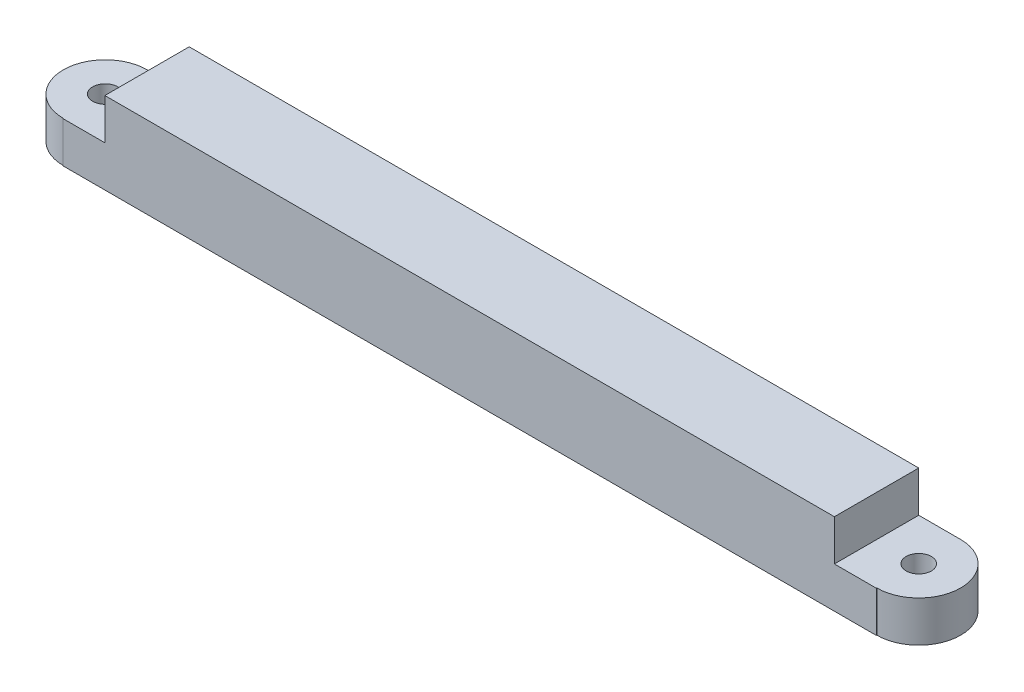
ISO-10303-21;
HEADER;
FILE_DESCRIPTION(('STEP AP214'),'2;1');
FILE_NAME('part.step','',(''),(''),'','','');
FILE_SCHEMA(('AUTOMOTIVE_DESIGN { 1 0 10303 214 1 1 1 1 }'));
ENDSEC;
DATA;
#1=APPLICATION_CONTEXT('core data for automotive mechanical design processes');
#2=APPLICATION_PROTOCOL_DEFINITION('international standard','automotive_design',2000,#1);
#3=PRODUCT_CONTEXT('',#1,'mechanical');
#4=PRODUCT('Part','Part','',(#3));
#5=PRODUCT_RELATED_PRODUCT_CATEGORY('part','',(#4));
#6=PRODUCT_DEFINITION_FORMATION('','',#4);
#7=PRODUCT_DEFINITION_CONTEXT('part definition',#1,'design');
#8=PRODUCT_DEFINITION('design','',#6,#7);
#9=PRODUCT_DEFINITION_SHAPE('','',#8);
#10=(LENGTH_UNIT() NAMED_UNIT(*) SI_UNIT(.MILLI.,.METRE.));
#11=(NAMED_UNIT(*) PLANE_ANGLE_UNIT() SI_UNIT($,.RADIAN.));
#12=(NAMED_UNIT(*) SI_UNIT($,.STERADIAN.) SOLID_ANGLE_UNIT());
#13=UNCERTAINTY_MEASURE_WITH_UNIT(LENGTH_MEASURE(1.E-05),#10,'distance_accuracy_value','');
#14=(GEOMETRIC_REPRESENTATION_CONTEXT(3) GLOBAL_UNCERTAINTY_ASSIGNED_CONTEXT((#13)) GLOBAL_UNIT_ASSIGNED_CONTEXT((#10,
#11,#12)) REPRESENTATION_CONTEXT('',''));
#15=CARTESIAN_POINT('',(0.,0.,0.));
#16=DIRECTION('',(0.,0.,1.));
#17=DIRECTION('',(1.,0.,0.));
#18=AXIS2_PLACEMENT_3D('',#15,#16,#17);
#19=CARTESIAN_POINT('',(-48.45,9.75,0.));
#20=DIRECTION('',(-1.,0.,0.));
#21=DIRECTION('',(0.,0.,1.));
#22=AXIS2_PLACEMENT_3D('',#19,#20,#21);
#23=PLANE('',#22);
#24=DIRECTION('',(0.,-1.,0.));
#25=VECTOR('',#24,1.);
#26=CARTESIAN_POINT('',(-48.45,9.75,5.04902762084879));
#27=LINE('',#26,#25);
#28=CARTESIAN_POINT('',(-48.45,4.875,5.04902762084879));
#29=VERTEX_POINT('',#28);
#30=CARTESIAN_POINT('',(-48.45,0.,5.04902762084879));
#31=VERTEX_POINT('',#30);
#32=EDGE_CURVE('E177',#29,#31,#27,.T.);
#33=ORIENTED_EDGE('',*,*,#32,.F.);
#34=DIRECTION('',(0.,0.,-1.));
#35=VECTOR('',#34,1.);
#36=CARTESIAN_POINT('',(-48.45,4.875,0.));
#37=LINE('',#36,#35);
#38=CARTESIAN_POINT('',(-48.45,4.875,5.));
#39=VERTEX_POINT('',#38);
#40=EDGE_CURVE('E135',#29,#39,#37,.T.);
#41=ORIENTED_EDGE('',*,*,#40,.T.);
#42=DIRECTION('',(0.,-1.,0.));
#43=VECTOR('',#42,1.);
#44=CARTESIAN_POINT('',(-48.45,9.75,5.));
#45=LINE('',#44,#43);
#46=CARTESIAN_POINT('',(-48.45,0.,5.));
#47=VERTEX_POINT('',#46);
#48=EDGE_CURVE('E174',#39,#47,#45,.T.);
#49=ORIENTED_EDGE('',*,*,#48,.T.);
#50=DIRECTION('',(0.,0.,-1.));
#51=VECTOR('',#50,1.);
#52=CARTESIAN_POINT('',(-48.45,0.,0.));
#53=LINE('',#52,#51);
#54=EDGE_CURVE('E168',#31,#47,#53,.T.);
#55=ORIENTED_EDGE('',*,*,#54,.F.);
#56=EDGE_LOOP('',(#33,#41,#49,#55));
#57=FACE_BOUND('',#56,.T.);
#58=ADVANCED_FACE('F35',(#57),#23,.T.);
#59=CARTESIAN_POINT('',(-48.45,9.75,0.));
#60=DIRECTION('',(0.,-1.,0.));
#61=DIRECTION('',(0.,0.,-1.));
#62=AXIS2_PLACEMENT_3D('',#59,#60,#61);
#63=CYLINDRICAL_SURFACE('',#62,1.5);
#64=CARTESIAN_POINT('',(-48.45,0.,0.));
#65=DIRECTION('',(0.,-1.,0.));
#66=DIRECTION('',(0.,0.,1.));
#67=AXIS2_PLACEMENT_3D('',#64,#65,#66);
#68=CIRCLE('',#67,1.5);
#69=CARTESIAN_POINT('',(-48.45,0.,1.5));
#70=VERTEX_POINT('',#69);
#71=EDGE_CURVE('E163',#70,#70,#68,.T.);
#72=ORIENTED_EDGE('',*,*,#71,.T.);
#73=EDGE_LOOP('',(#72));
#74=FACE_BOUND('',#73,.T.);
#75=CARTESIAN_POINT('',(-48.45,4.875,0.));
#76=DIRECTION('',(0.,-1.,0.));
#77=DIRECTION('',(0.,0.,1.));
#78=AXIS2_PLACEMENT_3D('',#75,#76,#77);
#79=CIRCLE('',#78,1.5);
#80=CARTESIAN_POINT('',(-48.45,4.875,1.5));
#81=VERTEX_POINT('',#80);
#82=EDGE_CURVE('E122',#81,#81,#79,.F.);
#83=ORIENTED_EDGE('',*,*,#82,.T.);
#84=EDGE_LOOP('',(#83));
#85=FACE_BOUND('',#84,.T.);
#86=ADVANCED_FACE('F245',(#74,#85),#63,.F.);
#87=CARTESIAN_POINT('',(-48.45,9.75,0.));
#88=DIRECTION('',(0.,-1.,0.));
#89=DIRECTION('',(0.,0.,-1.));
#90=AXIS2_PLACEMENT_3D('',#87,#88,#89);
#91=CYLINDRICAL_SURFACE('',#90,5.);
#92=ORIENTED_EDGE('',*,*,#48,.F.);
#93=CARTESIAN_POINT('',(-48.45,4.875,0.));
#94=DIRECTION('',(0.,-1.,0.));
#95=DIRECTION('',(0.,0.,1.));
#96=AXIS2_PLACEMENT_3D('',#93,#94,#95);
#97=CIRCLE('',#96,5.);
#98=CARTESIAN_POINT('',(-48.45,4.875,-5.00000000000001));
#99=VERTEX_POINT('',#98);
#100=EDGE_CURVE('E133',#39,#99,#97,.T.);
#101=ORIENTED_EDGE('',*,*,#100,.T.);
#102=DIRECTION('',(0.,-1.,0.));
#103=VECTOR('',#102,1.);
#104=CARTESIAN_POINT('',(-48.45,9.75,-5.00000000000001));
#105=LINE('',#104,#103);
#106=CARTESIAN_POINT('',(-48.45,0.,-5.00000000000001));
#107=VERTEX_POINT('',#106);
#108=EDGE_CURVE('E132',#99,#107,#105,.T.);
#109=ORIENTED_EDGE('',*,*,#108,.T.);
#110=CARTESIAN_POINT('',(-48.45,0.,0.));
#111=DIRECTION('',(0.,-1.,0.));
#112=DIRECTION('',(0.,0.,1.));
#113=AXIS2_PLACEMENT_3D('',#110,#111,#112);
#114=CIRCLE('',#113,5.);
#115=EDGE_CURVE('E171',#47,#107,#114,.T.);
#116=ORIENTED_EDGE('',*,*,#115,.F.);
#117=EDGE_LOOP('',(#92,#101,#109,#116));
#118=FACE_BOUND('',#117,.T.);
#119=ADVANCED_FACE('F215',(#118),#91,.T.);
#120=CARTESIAN_POINT('',(48.45,9.75,0.));
#121=DIRECTION('',(-1.,0.,0.));
#122=DIRECTION('',(0.,0.,1.));
#123=AXIS2_PLACEMENT_3D('',#120,#121,#122);
#124=PLANE('',#123);
#125=DIRECTION('',(0.,0.,-1.));
#126=VECTOR('',#125,1.);
#127=CARTESIAN_POINT('',(48.45,4.875,0.));
#128=LINE('',#127,#126);
#129=CARTESIAN_POINT('',(48.45,4.875,5.04902762084879));
#130=VERTEX_POINT('',#129);
#131=CARTESIAN_POINT('',(48.45,4.875,5.));
#132=VERTEX_POINT('',#131);
#133=EDGE_CURVE('E150',#130,#132,#128,.T.);
#134=ORIENTED_EDGE('',*,*,#133,.F.);
#135=DIRECTION('',(0.,-1.,0.));
#136=VECTOR('',#135,1.);
#137=CARTESIAN_POINT('',(48.45,9.75,5.04902762084879));
#138=LINE('',#137,#136);
#139=CARTESIAN_POINT('',(48.45,0.,5.04902762084879));
#140=VERTEX_POINT('',#139);
#141=EDGE_CURVE('E186',#130,#140,#138,.T.);
#142=ORIENTED_EDGE('',*,*,#141,.T.);
#143=DIRECTION('',(0.,0.,-1.));
#144=VECTOR('',#143,1.);
#145=CARTESIAN_POINT('',(48.45,0.,0.));
#146=LINE('',#145,#144);
#147=CARTESIAN_POINT('',(48.45,0.,5.));
#148=VERTEX_POINT('',#147);
#149=EDGE_CURVE('E189',#140,#148,#146,.T.);
#150=ORIENTED_EDGE('',*,*,#149,.T.);
#151=DIRECTION('',(0.,-1.,0.));
#152=VECTOR('',#151,1.);
#153=CARTESIAN_POINT('',(48.45,9.75,5.));
#154=LINE('',#153,#152);
#155=EDGE_CURVE('E11',#132,#148,#154,.T.);
#156=ORIENTED_EDGE('',*,*,#155,.F.);
#157=EDGE_LOOP('',(#134,#142,#150,#156));
#158=FACE_BOUND('',#157,.T.);
#159=ADVANCED_FACE('F224',(#158),#124,.F.);
#160=CARTESIAN_POINT('',(48.45,9.75,0.));
#161=DIRECTION('',(0.,-1.,0.));
#162=DIRECTION('',(0.,0.,-1.));
#163=AXIS2_PLACEMENT_3D('',#160,#161,#162);
#164=CYLINDRICAL_SURFACE('',#163,5.);
#165=CARTESIAN_POINT('',(48.45,4.875,0.));
#166=DIRECTION('',(0.,1.,0.));
#167=DIRECTION('',(0.,0.,1.));
#168=AXIS2_PLACEMENT_3D('',#165,#166,#167);
#169=CIRCLE('',#168,5.);
#170=CARTESIAN_POINT('',(48.45,4.875,-5.00000000000001));
#171=VERTEX_POINT('',#170);
#172=EDGE_CURVE('E152',#132,#171,#169,.T.);
#173=ORIENTED_EDGE('',*,*,#172,.F.);
#174=ORIENTED_EDGE('',*,*,#155,.T.);
#175=CARTESIAN_POINT('',(48.45,0.,0.));
#176=DIRECTION('',(0.,1.,0.));
#177=DIRECTION('',(0.,0.,1.));
#178=AXIS2_PLACEMENT_3D('',#175,#176,#177);
#179=CIRCLE('',#178,5.);
#180=CARTESIAN_POINT('',(48.45,0.,-5.00000000000001));
#181=VERTEX_POINT('',#180);
#182=EDGE_CURVE('E192',#148,#181,#179,.T.);
#183=ORIENTED_EDGE('',*,*,#182,.T.);
#184=DIRECTION('',(0.,-1.,0.));
#185=VECTOR('',#184,1.);
#186=CARTESIAN_POINT('',(48.45,9.75,-5.00000000000001));
#187=LINE('',#186,#185);
#188=EDGE_CURVE('E43',#171,#181,#187,.T.);
#189=ORIENTED_EDGE('',*,*,#188,.F.);
#190=EDGE_LOOP('',(#173,#174,#183,#189));
#191=FACE_BOUND('',#190,.T.);
#192=ADVANCED_FACE('F205',(#191),#164,.T.);
#193=CARTESIAN_POINT('',(0.,9.75,-5.));
#194=DIRECTION('',(0.,0.,1.));
#195=DIRECTION('',(1.,0.,0.));
#196=AXIS2_PLACEMENT_3D('',#193,#194,#195);
#197=PLANE('',#196);
#198=DIRECTION('',(1.,0.,0.));
#199=VECTOR('',#198,1.);
#200=CARTESIAN_POINT('',(0.,4.875,-5.));
#201=LINE('',#200,#199);
#202=CARTESIAN_POINT('',(-43.45,4.875,-5.));
#203=VERTEX_POINT('',#202);
#204=EDGE_CURVE('E50',#99,#203,#201,.T.);
#205=ORIENTED_EDGE('',*,*,#204,.T.);
#206=DIRECTION('',(0.,1.,0.));
#207=VECTOR('',#206,1.);
#208=CARTESIAN_POINT('',(-43.45,4.875,-5.));
#209=LINE('',#208,#207);
#210=CARTESIAN_POINT('',(-43.45,9.75,-5.));
#211=VERTEX_POINT('',#210);
#212=EDGE_CURVE('E112',#203,#211,#209,.T.);
#213=ORIENTED_EDGE('',*,*,#212,.T.);
#214=DIRECTION('',(-1.,0.,0.));
#215=VECTOR('',#214,1.);
#216=CARTESIAN_POINT('',(0.,9.75,-5.));
#217=LINE('',#216,#215);
#218=CARTESIAN_POINT('',(43.45,9.75,-5.));
#219=VERTEX_POINT('',#218);
#220=EDGE_CURVE('E180',#219,#211,#217,.T.);
#221=ORIENTED_EDGE('',*,*,#220,.F.);
#222=DIRECTION('',(0.,1.,0.));
#223=VECTOR('',#222,1.);
#224=CARTESIAN_POINT('',(43.45,4.875,-5.));
#225=LINE('',#224,#223);
#226=CARTESIAN_POINT('',(43.45,4.875,-5.));
#227=VERTEX_POINT('',#226);
#228=EDGE_CURVE('E58',#227,#219,#225,.T.);
#229=ORIENTED_EDGE('',*,*,#228,.F.);
#230=DIRECTION('',(-1.,0.,0.));
#231=VECTOR('',#230,1.);
#232=CARTESIAN_POINT('',(0.,4.875,-5.));
#233=LINE('',#232,#231);
#234=EDGE_CURVE('E154',#171,#227,#233,.T.);
#235=ORIENTED_EDGE('',*,*,#234,.F.);
#236=ORIENTED_EDGE('',*,*,#188,.T.);
#237=DIRECTION('',(-1.,0.,0.));
#238=VECTOR('',#237,1.);
#239=CARTESIAN_POINT('',(0.,0.,-5.));
#240=LINE('',#239,#238);
#241=EDGE_CURVE('E195',#181,#107,#240,.T.);
#242=ORIENTED_EDGE('',*,*,#241,.T.);
#243=ORIENTED_EDGE('',*,*,#108,.F.);
#244=EDGE_LOOP('',(#205,#213,#221,#229,#235,#236,#242,#243));
#245=FACE_BOUND('',#244,.T.);
#246=ADVANCED_FACE('F130',(#245),#197,.F.);
#247=CARTESIAN_POINT('',(48.45,9.75,0.));
#248=DIRECTION('',(0.,-1.,0.));
#249=DIRECTION('',(0.,0.,-1.));
#250=AXIS2_PLACEMENT_3D('',#247,#248,#249);
#251=CYLINDRICAL_SURFACE('',#250,1.5);
#252=CARTESIAN_POINT('',(48.45,0.,0.));
#253=DIRECTION('',(0.,1.,0.));
#254=DIRECTION('',(0.,0.,1.));
#255=AXIS2_PLACEMENT_3D('',#252,#253,#254);
#256=CIRCLE('',#255,1.5);
#257=CARTESIAN_POINT('',(48.45,0.,1.5));
#258=VERTEX_POINT('',#257);
#259=EDGE_CURVE('E179',#258,#258,#256,.T.);
#260=ORIENTED_EDGE('',*,*,#259,.F.);
#261=EDGE_LOOP('',(#260));
#262=FACE_BOUND('',#261,.T.);
#263=CARTESIAN_POINT('',(48.45,4.875,0.));
#264=DIRECTION('',(0.,1.,0.));
#265=DIRECTION('',(0.,0.,1.));
#266=AXIS2_PLACEMENT_3D('',#263,#264,#265);
#267=CIRCLE('',#266,1.5);
#268=CARTESIAN_POINT('',(48.45,4.875,1.5));
#269=VERTEX_POINT('',#268);
#270=EDGE_CURVE('E157',#269,#269,#267,.F.);
#271=ORIENTED_EDGE('',*,*,#270,.F.);
#272=EDGE_LOOP('',(#271));
#273=FACE_BOUND('',#272,.T.);
#274=ADVANCED_FACE('F37',(#262,#273),#251,.F.);
#275=CARTESIAN_POINT('',(0.,9.75,5.0490276208488));
#276=DIRECTION('',(0.,0.,1.));
#277=DIRECTION('',(1.,0.,0.));
#278=AXIS2_PLACEMENT_3D('',#275,#276,#277);
#279=PLANE('',#278);
#280=DIRECTION('',(0.,1.,0.));
#281=VECTOR('',#280,1.);
#282=CARTESIAN_POINT('',(-43.45,4.875,5.04902762084879));
#283=LINE('',#282,#281);
#284=CARTESIAN_POINT('',(-43.45,4.875,5.04902762084879));
#285=VERTEX_POINT('',#284);
#286=CARTESIAN_POINT('',(-43.45,9.75,5.04902762084879));
#287=VERTEX_POINT('',#286);
#288=EDGE_CURVE('E121',#285,#287,#283,.T.);
#289=ORIENTED_EDGE('',*,*,#288,.F.);
#290=DIRECTION('',(-1.,0.,0.));
#291=VECTOR('',#290,1.);
#292=CARTESIAN_POINT('',(0.,4.875,5.0490276208488));
#293=LINE('',#292,#291);
#294=EDGE_CURVE('E127',#285,#29,#293,.T.);
#295=ORIENTED_EDGE('',*,*,#294,.T.);
#296=ORIENTED_EDGE('',*,*,#32,.T.);
#297=DIRECTION('',(-1.,0.,0.));
#298=VECTOR('',#297,1.);
#299=CARTESIAN_POINT('',(0.,0.,5.0490276208488));
#300=LINE('',#299,#298);
#301=EDGE_CURVE('E183',#140,#31,#300,.T.);
#302=ORIENTED_EDGE('',*,*,#301,.F.);
#303=ORIENTED_EDGE('',*,*,#141,.F.);
#304=DIRECTION('',(1.,0.,0.));
#305=VECTOR('',#304,1.);
#306=CARTESIAN_POINT('',(0.,4.875,5.0490276208488));
#307=LINE('',#306,#305);
#308=CARTESIAN_POINT('',(43.45,4.875,5.04902762084879));
#309=VERTEX_POINT('',#308);
#310=EDGE_CURVE('E148',#309,#130,#307,.T.);
#311=ORIENTED_EDGE('',*,*,#310,.F.);
#312=DIRECTION('',(0.,1.,0.));
#313=VECTOR('',#312,1.);
#314=CARTESIAN_POINT('',(43.45,4.875,5.04902762084879));
#315=LINE('',#314,#313);
#316=CARTESIAN_POINT('',(43.45,9.75,5.04902762084879));
#317=VERTEX_POINT('',#316);
#318=EDGE_CURVE('E160',#309,#317,#315,.T.);
#319=ORIENTED_EDGE('',*,*,#318,.T.);
#320=DIRECTION('',(-1.,0.,0.));
#321=VECTOR('',#320,1.);
#322=CARTESIAN_POINT('',(0.,9.75,5.0490276208488));
#323=LINE('',#322,#321);
#324=EDGE_CURVE('E182',#317,#287,#323,.T.);
#325=ORIENTED_EDGE('',*,*,#324,.T.);
#326=EDGE_LOOP('',(#289,#295,#296,#302,#303,#311,#319,#325));
#327=FACE_BOUND('',#326,.T.);
#328=ADVANCED_FACE('F220',(#327),#279,.T.);
#329=CARTESIAN_POINT('',(0.,9.75,0.));
#330=DIRECTION('',(0.,1.,0.));
#331=DIRECTION('',(0.,0.,1.));
#332=AXIS2_PLACEMENT_3D('',#329,#330,#331);
#333=PLANE('',#332);
#334=DIRECTION('',(0.,0.,-1.));
#335=VECTOR('',#334,1.);
#336=CARTESIAN_POINT('',(-43.45,9.75,0.));
#337=LINE('',#336,#335);
#338=EDGE_CURVE('E117',#287,#211,#337,.T.);
#339=ORIENTED_EDGE('',*,*,#338,.F.);
#340=ORIENTED_EDGE('',*,*,#324,.F.);
#341=DIRECTION('',(0.,0.,-1.));
#342=VECTOR('',#341,1.);
#343=CARTESIAN_POINT('',(43.45,9.75,0.));
#344=LINE('',#343,#342);
#345=EDGE_CURVE('E144',#317,#219,#344,.T.);
#346=ORIENTED_EDGE('',*,*,#345,.T.);
#347=ORIENTED_EDGE('',*,*,#220,.T.);
#348=EDGE_LOOP('',(#339,#340,#346,#347));
#349=FACE_BOUND('',#348,.T.);
#350=ADVANCED_FACE('F233',(#349),#333,.T.);
#351=CARTESIAN_POINT('',(0.,0.,0.));
#352=DIRECTION('',(0.,1.,0.));
#353=DIRECTION('',(0.,0.,1.));
#354=AXIS2_PLACEMENT_3D('',#351,#352,#353);
#355=PLANE('',#354);
#356=ORIENTED_EDGE('',*,*,#259,.T.);
#357=EDGE_LOOP('',(#356));
#358=FACE_BOUND('',#357,.T.);
#359=ORIENTED_EDGE('',*,*,#149,.F.);
#360=ORIENTED_EDGE('',*,*,#301,.T.);
#361=ORIENTED_EDGE('',*,*,#54,.T.);
#362=ORIENTED_EDGE('',*,*,#115,.T.);
#363=ORIENTED_EDGE('',*,*,#241,.F.);
#364=ORIENTED_EDGE('',*,*,#182,.F.);
#365=EDGE_LOOP('',(#359,#360,#361,#362,#363,#364));
#366=FACE_BOUND('',#365,.T.);
#367=ORIENTED_EDGE('',*,*,#71,.F.);
#368=EDGE_LOOP('',(#367));
#369=FACE_BOUND('',#368,.T.);
#370=ADVANCED_FACE('F209',(#358,#366,#369),#355,.F.);
#371=CARTESIAN_POINT('',(43.45,4.875,0.));
#372=DIRECTION('',(1.,0.,0.));
#373=DIRECTION('',(0.,0.,-1.));
#374=AXIS2_PLACEMENT_3D('',#371,#372,#373);
#375=PLANE('',#374);
#376=ORIENTED_EDGE('',*,*,#345,.F.);
#377=ORIENTED_EDGE('',*,*,#318,.F.);
#378=DIRECTION('',(0.,0.,-1.));
#379=VECTOR('',#378,1.);
#380=CARTESIAN_POINT('',(43.45,4.875,0.));
#381=LINE('',#380,#379);
#382=EDGE_CURVE('E146',#309,#227,#381,.T.);
#383=ORIENTED_EDGE('',*,*,#382,.T.);
#384=ORIENTED_EDGE('',*,*,#228,.T.);
#385=EDGE_LOOP('',(#376,#377,#383,#384));
#386=FACE_BOUND('',#385,.T.);
#387=ADVANCED_FACE('F231',(#386),#375,.T.);
#388=CARTESIAN_POINT('',(0.,4.875,0.));
#389=DIRECTION('',(0.,1.,0.));
#390=DIRECTION('',(0.,0.,1.));
#391=AXIS2_PLACEMENT_3D('',#388,#389,#390);
#392=PLANE('',#391);
#393=ORIENTED_EDGE('',*,*,#382,.F.);
#394=ORIENTED_EDGE('',*,*,#310,.T.);
#395=ORIENTED_EDGE('',*,*,#133,.T.);
#396=ORIENTED_EDGE('',*,*,#172,.T.);
#397=ORIENTED_EDGE('',*,*,#234,.T.);
#398=EDGE_LOOP('',(#393,#394,#395,#396,#397));
#399=FACE_BOUND('',#398,.T.);
#400=ORIENTED_EDGE('',*,*,#270,.T.);
#401=EDGE_LOOP('',(#400));
#402=FACE_BOUND('',#401,.T.);
#403=ADVANCED_FACE('F229',(#399,#402),#392,.T.);
#404=CARTESIAN_POINT('',(-43.45,4.875,0.));
#405=DIRECTION('',(1.,0.,0.));
#406=DIRECTION('',(0.,0.,-1.));
#407=AXIS2_PLACEMENT_3D('',#404,#405,#406);
#408=PLANE('',#407);
#409=ORIENTED_EDGE('',*,*,#338,.T.);
#410=ORIENTED_EDGE('',*,*,#212,.F.);
#411=DIRECTION('',(0.,0.,-1.));
#412=VECTOR('',#411,1.);
#413=CARTESIAN_POINT('',(-43.45,4.875,0.));
#414=LINE('',#413,#412);
#415=EDGE_CURVE('E114',#285,#203,#414,.T.);
#416=ORIENTED_EDGE('',*,*,#415,.F.);
#417=ORIENTED_EDGE('',*,*,#288,.T.);
#418=EDGE_LOOP('',(#409,#410,#416,#417));
#419=FACE_BOUND('',#418,.T.);
#420=ADVANCED_FACE('F113',(#419),#408,.F.);
#421=CARTESIAN_POINT('',(0.,4.875,0.));
#422=DIRECTION('',(0.,1.,0.));
#423=DIRECTION('',(0.,0.,1.));
#424=AXIS2_PLACEMENT_3D('',#421,#422,#423);
#425=PLANE('',#424);
#426=ORIENTED_EDGE('',*,*,#415,.T.);
#427=ORIENTED_EDGE('',*,*,#204,.F.);
#428=ORIENTED_EDGE('',*,*,#100,.F.);
#429=ORIENTED_EDGE('',*,*,#40,.F.);
#430=ORIENTED_EDGE('',*,*,#294,.F.);
#431=EDGE_LOOP('',(#426,#427,#428,#429,#430));
#432=FACE_BOUND('',#431,.T.);
#433=ORIENTED_EDGE('',*,*,#82,.F.);
#434=EDGE_LOOP('',(#433));
#435=FACE_BOUND('',#434,.T.);
#436=ADVANCED_FACE('F124',(#432,#435),#425,.T.);
#437=CLOSED_SHELL('',(#58,#86,#119,#159,#192,#246,#274,#328,#350,#370,#387,#403,#420,#436));
#438=MANIFOLD_SOLID_BREP('B2',#437);
#439=ADVANCED_BREP_SHAPE_REPRESENTATION('',(#18,#438),#14);
#440=SHAPE_DEFINITION_REPRESENTATION(#9,#439);
ENDSEC;
END-ISO-10303-21;
